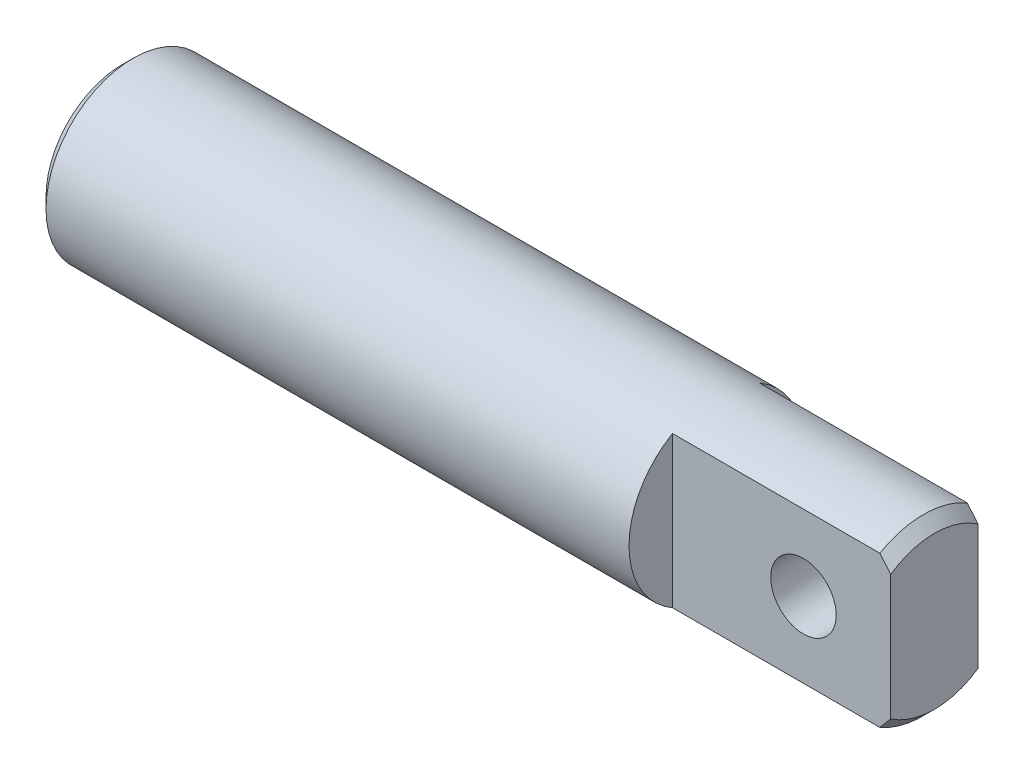
ISO-10303-21;
HEADER;
FILE_DESCRIPTION(('STEP AP214'),'2;1');
FILE_NAME('part.step','',(''),(''),'','','');
FILE_SCHEMA(('AUTOMOTIVE_DESIGN { 1 0 10303 214 1 1 1 1 }'));
ENDSEC;
DATA;
#1=APPLICATION_CONTEXT('core data for automotive mechanical design processes');
#2=APPLICATION_PROTOCOL_DEFINITION('international standard','automotive_design',2000,#1);
#3=PRODUCT_CONTEXT('',#1,'mechanical');
#4=PRODUCT('Part','Part','',(#3));
#5=PRODUCT_RELATED_PRODUCT_CATEGORY('part','',(#4));
#6=PRODUCT_DEFINITION_FORMATION('','',#4);
#7=PRODUCT_DEFINITION_CONTEXT('part definition',#1,'design');
#8=PRODUCT_DEFINITION('design','',#6,#7);
#9=PRODUCT_DEFINITION_SHAPE('','',#8);
#10=(LENGTH_UNIT() NAMED_UNIT(*) SI_UNIT(.MILLI.,.METRE.));
#11=(NAMED_UNIT(*) PLANE_ANGLE_UNIT() SI_UNIT($,.RADIAN.));
#12=(NAMED_UNIT(*) SI_UNIT($,.STERADIAN.) SOLID_ANGLE_UNIT());
#13=UNCERTAINTY_MEASURE_WITH_UNIT(LENGTH_MEASURE(1.E-05),#10,'distance_accuracy_value','');
#14=(GEOMETRIC_REPRESENTATION_CONTEXT(3) GLOBAL_UNCERTAINTY_ASSIGNED_CONTEXT((#13)) GLOBAL_UNIT_ASSIGNED_CONTEXT((#10,
#11,#12)) REPRESENTATION_CONTEXT('',''));
#15=CARTESIAN_POINT('',(0.,0.,0.));
#16=DIRECTION('',(0.,0.,1.));
#17=DIRECTION('',(1.,0.,0.));
#18=AXIS2_PLACEMENT_3D('',#15,#16,#17);
#19=CARTESIAN_POINT('',(-0.599999999999986,14.9999999999999,0.));
#20=DIRECTION('',(-1.,0.,0.));
#21=DIRECTION('',(0.,0.,1.));
#22=AXIS2_PLACEMENT_3D('',#19,#20,#21);
#23=CONICAL_SURFACE('',#22,2.1,1.02974425867665);
#24=CARTESIAN_POINT('',(0.661807299957892,14.9999999999999,0.));
#25=VERTEX_POINT('',#24);
#26=VERTEX_LOOP('',#25);
#27=FACE_BOUND('',#26,.T.);
#28=CARTESIAN_POINT('',(-0.599999999999986,14.9999999999999,0.));
#29=DIRECTION('',(-1.,0.,0.));
#30=DIRECTION('',(0.,0.,1.));
#31=AXIS2_PLACEMENT_3D('',#28,#29,#30);
#32=CIRCLE('',#31,2.1);
#33=CARTESIAN_POINT('',(-0.599999999999986,14.9999999999999,2.1));
#34=VERTEX_POINT('',#33);
#35=EDGE_CURVE('E77',#34,#34,#32,.T.);
#36=ORIENTED_EDGE('',*,*,#35,.T.);
#37=EDGE_LOOP('',(#36));
#38=FACE_BOUND('',#37,.T.);
#39=ADVANCED_FACE('F16',(#27,#38),#23,.F.);
#40=CARTESIAN_POINT('',(-21.78,14.9999999999999,0.));
#41=DIRECTION('',(-1.,0.,0.));
#42=DIRECTION('',(0.,0.,1.));
#43=AXIS2_PLACEMENT_3D('',#40,#41,#42);
#44=CYLINDRICAL_SURFACE('',#43,2.1);
#45=ORIENTED_EDGE('',*,*,#35,.F.);
#46=EDGE_LOOP('',(#45));
#47=FACE_BOUND('',#46,.T.);
#48=CARTESIAN_POINT('',(-2.99999999999999,14.9999999999999,0.));
#49=DIRECTION('',(-1.,0.,0.));
#50=DIRECTION('',(0.,0.,1.));
#51=AXIS2_PLACEMENT_3D('',#48,#49,#50);
#52=CIRCLE('',#51,2.1);
#53=CARTESIAN_POINT('',(-2.99999999999999,14.9999999999999,2.1));
#54=VERTEX_POINT('',#53);
#55=EDGE_CURVE('E79',#54,#54,#52,.T.);
#56=ORIENTED_EDGE('',*,*,#55,.T.);
#57=EDGE_LOOP('',(#56));
#58=FACE_BOUND('',#57,.T.);
#59=ADVANCED_FACE('F73',(#47,#58),#44,.F.);
#60=CARTESIAN_POINT('',(-2.99999999999999,17.0999999999999,0.));
#61=DIRECTION('',(1.,0.,0.));
#62=DIRECTION('',(0.,0.,-1.));
#63=AXIS2_PLACEMENT_3D('',#60,#61,#62);
#64=PLANE('',#63);
#65=ORIENTED_EDGE('',*,*,#55,.F.);
#66=EDGE_LOOP('',(#65));
#67=FACE_BOUND('',#66,.T.);
#68=CARTESIAN_POINT('',(-2.99999999999999,14.9999999999999,0.));
#69=DIRECTION('',(-1.,0.,0.));
#70=DIRECTION('',(0.,0.,1.));
#71=AXIS2_PLACEMENT_3D('',#68,#69,#70);
#72=CIRCLE('',#71,2.5);
#73=CARTESIAN_POINT('',(-2.99999999999999,14.9999999999999,2.5));
#74=VERTEX_POINT('',#73);
#75=EDGE_CURVE('E83',#74,#74,#72,.T.);
#76=ORIENTED_EDGE('',*,*,#75,.T.);
#77=EDGE_LOOP('',(#76));
#78=FACE_BOUND('',#77,.T.);
#79=ADVANCED_FACE('F198',(#67,#78),#64,.F.);
#80=CARTESIAN_POINT('',(-21.78,14.9999999999999,0.));
#81=DIRECTION('',(-1.,0.,0.));
#82=DIRECTION('',(0.,0.,1.));
#83=AXIS2_PLACEMENT_3D('',#80,#81,#82);
#84=CYLINDRICAL_SURFACE('',#83,2.5);
#85=ORIENTED_EDGE('',*,*,#75,.F.);
#86=EDGE_LOOP('',(#85));
#87=FACE_BOUND('',#86,.T.);
#88=CARTESIAN_POINT('',(-22.,14.9999999999999,0.));
#89=DIRECTION('',(-1.,0.,0.));
#90=DIRECTION('',(0.,0.,1.));
#91=AXIS2_PLACEMENT_3D('',#88,#89,#90);
#92=CIRCLE('',#91,2.5);
#93=CARTESIAN_POINT('',(-22.,14.9999999999999,2.5));
#94=VERTEX_POINT('',#93);
#95=EDGE_CURVE('E80',#94,#94,#92,.T.);
#96=ORIENTED_EDGE('',*,*,#95,.T.);
#97=EDGE_LOOP('',(#96));
#98=FACE_BOUND('',#97,.T.);
#99=ADVANCED_FACE('F164',(#87,#98),#84,.F.);
#100=CARTESIAN_POINT('',(15.22,14.9999999999999,0.));
#101=DIRECTION('',(-1.,0.,0.));
#102=DIRECTION('',(0.,0.,1.));
#103=AXIS2_PLACEMENT_3D('',#100,#101,#102);
#104=CONICAL_SURFACE('',#103,3.495,0.785398163397443);
#105=CARTESIAN_POINT('',(9.9164224383253,6.43174655435509,2.));
#106=CARTESIAN_POINT('',(10.1265610711491,6.64754817369593,2.));
#107=CARTESIAN_POINT('',(10.3365030502145,6.86354197413312,2.));
#108=CARTESIAN_POINT('',(10.7558601077184,7.29605469798561,2.));
#109=CARTESIAN_POINT('',(10.9652751678765,7.5125736391215,2.));
#110=CARTESIAN_POINT('',(11.3839178863779,7.94676825664768,2.));
#111=CARTESIAN_POINT('',(11.5931439692592,8.16444545301494,2.));
#112=CARTESIAN_POINT('',(12.0106964661649,8.60065038014004,2.));
#113=CARTESIAN_POINT('',(12.2190229045123,8.81917808759559,2.));
#114=CARTESIAN_POINT('',(12.6625473922232,9.2869923926392,2.));
#115=CARTESIAN_POINT('',(12.8975714726616,9.53644407382509,2.));
#116=CARTESIAN_POINT('',(13.365382542186,10.0374868658117,2.));
#117=CARTESIAN_POINT('',(13.5981693265889,10.2890781684647,2.));
#118=CARTESIAN_POINT('',(13.9444944603264,10.668676836453,2.));
#119=CARTESIAN_POINT('',(14.0593636160604,10.7954693125045,2.));
#120=CARTESIAN_POINT('',(14.2879575819006,11.0500807231577,2.));
#121=CARTESIAN_POINT('',(14.4016824058333,11.1778996453237,2.));
#122=CARTESIAN_POINT('',(14.6276208309937,11.4348338705895,2.));
#123=CARTESIAN_POINT('',(14.7398346591475,11.5639489738239,2.));
#124=CARTESIAN_POINT('',(14.9622539679496,11.8238944802724,2.));
#125=CARTESIAN_POINT('',(15.0724595441633,11.9547248013533,2.));
#126=CARTESIAN_POINT('',(15.2509674584486,12.1712548824459,2.));
#127=CARTESIAN_POINT('',(15.3200940076278,12.2562744592166,2.));
#128=CARTESIAN_POINT('',(15.4569007358004,12.4274788435985,2.));
#129=CARTESIAN_POINT('',(15.5245808509638,12.5136637023601,2.));
#130=CARTESIAN_POINT('',(15.6582798823296,12.6877168029346,2.));
#131=CARTESIAN_POINT('',(15.7242933858479,12.7755892167168,2.));
#132=CARTESIAN_POINT('',(15.8538736821759,12.9531172246593,2.));
#133=CARTESIAN_POINT('',(15.9174406919965,13.0427726595856,2.));
#134=CARTESIAN_POINT('',(16.0397325008814,13.2220116918911,2.));
#135=CARTESIAN_POINT('',(16.0985394083859,13.3115389167384,2.));
#136=CARTESIAN_POINT('',(16.2119750725487,13.4932878503426,2.));
#137=CARTESIAN_POINT('',(16.2666018895126,13.5855107828901,2.));
#138=CARTESIAN_POINT('',(16.3697861502893,13.7727633230229,2.));
#139=CARTESIAN_POINT('',(16.4183709121438,13.8677777028944,2.));
#140=CARTESIAN_POINT('',(16.5074204738147,14.0614989237175,2.));
#141=CARTESIAN_POINT('',(16.5478958460363,14.1602007553028,2.));
#142=CARTESIAN_POINT('',(16.6030220150854,14.3192323779838,2.));
#143=CARTESIAN_POINT('',(16.6213807318649,14.3782753482258,2.));
#144=CARTESIAN_POINT('',(16.6536619590802,14.4975937680992,2.));
#145=CARTESIAN_POINT('',(16.6675835516981,14.5578694699805,2.));
#146=CARTESIAN_POINT('',(16.6902938856327,14.6791218401361,2.));
#147=CARTESIAN_POINT('',(16.6991047061924,14.7400943150277,2.));
#148=CARTESIAN_POINT('',(16.7112104970251,14.862582307051,2.));
#149=CARTESIAN_POINT('',(16.714506488385,14.9240977215351,2.));
#150=CARTESIAN_POINT('',(16.7153920634469,15.047412776839,2.));
#151=CARTESIAN_POINT('',(16.7129591353816,15.1092125833611,2.));
#152=CARTESIAN_POINT('',(16.7024859271394,15.2323300147828,2.));
#153=CARTESIAN_POINT('',(16.6944453402081,15.2936476131187,2.));
#154=CARTESIAN_POINT('',(16.6731582781794,15.4156227530155,2.));
#155=CARTESIAN_POINT('',(16.6598902618416,15.4762764821604,2.));
#156=CARTESIAN_POINT('',(16.6287810282415,15.5963853864009,2.));
#157=CARTESIAN_POINT('',(16.6109393827061,15.6558404486911,2.));
#158=CARTESIAN_POINT('',(16.5489227599763,15.8401709094853,2.));
#159=CARTESIAN_POINT('',(16.497840214504,15.9627230464006,2.));
#160=CARTESIAN_POINT('',(16.3838644374412,16.2022228512532,2.));
#161=CARTESIAN_POINT('',(16.3209488779717,16.3191593906661,2.));
#162=CARTESIAN_POINT('',(16.1868797980904,16.5492496963114,2.));
#163=CARTESIAN_POINT('',(16.1156717742496,16.6623713117407,2.));
#164=CARTESIAN_POINT('',(16.004898834961,16.8293063300411,2.));
#165=CARTESIAN_POINT('',(15.9673306980646,16.8844712260242,2.));
#166=CARTESIAN_POINT('',(15.8910728320596,16.9940191019984,2.));
#167=CARTESIAN_POINT('',(15.8523831433383,17.0484021100402,2.));
#168=CARTESIAN_POINT('',(15.7277647668871,17.2204078132625,2.));
#169=CARTESIAN_POINT('',(15.6400819162954,17.3367585946478,2.));
#170=CARTESIAN_POINT('',(15.4616120642076,17.5670620663371,2.));
#171=CARTESIAN_POINT('',(15.3708245800271,17.6810143792559,2.));
#172=CARTESIAN_POINT('',(15.1869539430972,17.9071363012447,2.));
#173=CARTESIAN_POINT('',(15.0938697231723,18.0193050402017,2.));
#174=CARTESIAN_POINT('',(14.906009890199,18.2422194514275,2.));
#175=CARTESIAN_POINT('',(14.8112342151887,18.3529650713075,2.));
#176=CARTESIAN_POINT('',(14.5246660649253,18.6839099531016,2.));
#177=CARTESIAN_POINT('',(14.3309457821405,18.9024379286574,2.));
#178=CARTESIAN_POINT('',(13.9403909622291,19.336561567545,2.));
#179=CARTESIAN_POINT('',(13.7435573227561,19.5521580439207,2.));
#180=CARTESIAN_POINT('',(13.3482925056411,19.9808031463554,2.));
#181=CARTESIAN_POINT('',(13.1498670763614,20.19385707996,2.));
#182=CARTESIAN_POINT('',(12.7515192987213,20.6185863123391,2.));
#183=CARTESIAN_POINT('',(12.5515968463192,20.830261513345,2.));
#184=CARTESIAN_POINT('',(12.150833669179,21.252413066286,2.));
#185=CARTESIAN_POINT('',(11.9499938226034,21.4628902526065,2.));
#186=CARTESIAN_POINT('',(11.5475039831171,21.8830685886929,2.));
#187=CARTESIAN_POINT('',(11.3458539891456,22.0927697374421,2.));
#188=CARTESIAN_POINT('',(11.0418858761726,22.4079319483174,2.));
#189=CARTESIAN_POINT('',(10.9398003265283,22.5136174988749,2.));
#190=CARTESIAN_POINT('',(10.7354747698068,22.7248652599549,2.));
#191=CARTESIAN_POINT('',(10.6332347447099,22.83042745305,2.));
#192=CARTESIAN_POINT('',(10.4286237308527,23.041436236008,2.));
#193=CARTESIAN_POINT('',(10.3262527351095,23.1468828190984,2.));
#194=CARTESIAN_POINT('',(10.1214117871002,23.3576534749507,2.));
#195=CARTESIAN_POINT('',(10.018941849245,23.4629775617176,2.));
#196=CARTESIAN_POINT('',(9.9164224383253,23.5682534456448,2.));
#197=B_SPLINE_CURVE_WITH_KNOTS('',3,(#105,#106,#107,#108,#109,#110,#111,#112,#113,#114,#115,
#116,#117,#118,#119,#120,#121,#122,#123,#124,#125,#126,#127,#128,#129,#130,#131,#132,#133,#134,
#135,#136,#137,#138,#139,#140,#141,#142,#143,#144,#145,#146,#147,#148,#149,#150,#151,#152,#153,
#154,#155,#156,#157,#158,#159,#160,#161,#162,#163,#164,#165,#166,#167,#168,#169,#170,#171,#172,
#173,#174,#175,#176,#177,#178,#179,#180,#181,#182,#183,#184,#185,#186,#187,#188,#189,#190,#191,
#192,#193,#194,#195,#196),.UNSPECIFIED.,.F.,.F.,(4,2,2,2,2,2,2,2,2,2,2,2,2,2,2,2,2,2,2,2,2,2,2,
2,2,2,2,2,2,2,2,2,2,2,2,2,2,2,2,2,2,2,2,2,2,4),(0.,0.903636193784462,1.80730331677087,
2.71307747702475,3.61882699317427,4.64700319696608,5.67527258666949,6.18853289831541,
6.70178700105632,7.21496314207468,7.72811479878303,8.0568295854466,8.38555884823469,
8.71524558859147,9.04490301709644,9.36616107350936,9.68756731104285,10.0074630147977,
10.3269389094852,10.5122918000299,10.6976830059232,10.8822672136598,11.0668172413002,
11.2520936670242,11.4373802286797,11.6234384439018,11.809514087921,12.2067423548292,
12.6047278169828,13.0054948807139,13.2057131553988,13.4059242290945,13.8429116718964,
14.279967365821,14.7172301106781,15.1545089064926,16.0305420045028,16.9063269664553,
17.7797472787007,18.6532288669151,19.5260006907685,20.3987736577733,20.8395887748786,
21.280460047577,21.7213558968197,22.1621950741425),.UNSPECIFIED.);
#198=CARTESIAN_POINT('',(14.72,11.5416730923753,2.));
#199=VERTEX_POINT('',#198);
#200=CARTESIAN_POINT('',(15.22,12.1338135092077,2.));
#201=VERTEX_POINT('',#200);
#202=EDGE_CURVE('E173',#199,#201,#197,.T.);
#203=ORIENTED_EDGE('',*,*,#202,.F.);
#204=CARTESIAN_POINT('',(14.72,14.9999999999999,0.));
#205=DIRECTION('',(1.,0.,0.));
#206=DIRECTION('',(0.,0.,-1.));
#207=AXIS2_PLACEMENT_3D('',#204,#205,#206);
#208=CIRCLE('',#207,3.995);
#209=CARTESIAN_POINT('',(14.72,11.5416730923754,-2.));
#210=VERTEX_POINT('',#209);
#211=EDGE_CURVE('E118',#210,#199,#208,.F.);
#212=ORIENTED_EDGE('',*,*,#211,.F.);
#213=CARTESIAN_POINT('',(9.9164224383253,23.5682534456448,-2.));
#214=CARTESIAN_POINT('',(10.1265610711491,23.3524518263039,-2.));
#215=CARTESIAN_POINT('',(10.3365030502145,23.1364580258667,-2.));
#216=CARTESIAN_POINT('',(10.7558601077184,22.7039453020143,-2.));
#217=CARTESIAN_POINT('',(10.9652751678765,22.4874263608784,-2.));
#218=CARTESIAN_POINT('',(11.3839178863779,22.0532317433522,-2.));
#219=CARTESIAN_POINT('',(11.5931439692592,21.8355545469849,-2.));
#220=CARTESIAN_POINT('',(12.0106964661649,21.3993496198598,-2.));
#221=CARTESIAN_POINT('',(12.2190229045123,21.1808219124043,-2.));
#222=CARTESIAN_POINT('',(12.6625473922232,20.7130076073607,-2.));
#223=CARTESIAN_POINT('',(12.8975714726616,20.4635559261748,-2.));
#224=CARTESIAN_POINT('',(13.365382542186,19.9625131341881,-2.));
#225=CARTESIAN_POINT('',(13.5981693265889,19.7109218315351,-2.));
#226=CARTESIAN_POINT('',(13.9444944603264,19.3313231635469,-2.));
#227=CARTESIAN_POINT('',(14.0593636160603,19.2045306874954,-2.));
#228=CARTESIAN_POINT('',(14.2879575819006,18.9499192768422,-2.));
#229=CARTESIAN_POINT('',(14.4016824058333,18.8221003546762,-2.));
#230=CARTESIAN_POINT('',(14.6276208309937,18.5651661294104,-2.));
#231=CARTESIAN_POINT('',(14.7398346591475,18.4360510261759,-2.));
#232=CARTESIAN_POINT('',(14.9622539679496,18.1761055197275,-2.));
#233=CARTESIAN_POINT('',(15.0724595441633,18.0452751986466,-2.));
#234=CARTESIAN_POINT('',(15.2509674584485,17.828745117554,-2.));
#235=CARTESIAN_POINT('',(15.3200940076277,17.7437255407833,-2.));
#236=CARTESIAN_POINT('',(15.4569007358004,17.5725211564014,-2.));
#237=CARTESIAN_POINT('',(15.5245808509637,17.4863362976399,-2.));
#238=CARTESIAN_POINT('',(15.6582798823295,17.3122831970653,-2.));
#239=CARTESIAN_POINT('',(15.7242933858478,17.2244107832831,-2.));
#240=CARTESIAN_POINT('',(15.8538736821759,17.0468827753407,-2.));
#241=CARTESIAN_POINT('',(15.9174406919965,16.9572273404143,-2.));
#242=CARTESIAN_POINT('',(16.0397325008814,16.7779883081088,-2.));
#243=CARTESIAN_POINT('',(16.0985394083858,16.6884610832615,-2.));
#244=CARTESIAN_POINT('',(16.2119750725486,16.5067121496573,-2.));
#245=CARTESIAN_POINT('',(16.2666018895126,16.4144892171098,-2.));
#246=CARTESIAN_POINT('',(16.3697861502893,16.227236676977,-2.));
#247=CARTESIAN_POINT('',(16.4183709121437,16.1322222971055,-2.));
#248=CARTESIAN_POINT('',(16.5074204738147,15.9385010762824,-2.));
#249=CARTESIAN_POINT('',(16.5478958460363,15.8397992446972,-2.));
#250=CARTESIAN_POINT('',(16.6030220150854,15.6807676220161,-2.));
#251=CARTESIAN_POINT('',(16.6213807318649,15.6217246517741,-2.));
#252=CARTESIAN_POINT('',(16.6536619590802,15.5024062319007,-2.));
#253=CARTESIAN_POINT('',(16.6675835516981,15.4421305300195,-2.));
#254=CARTESIAN_POINT('',(16.6902938856327,15.3208781598638,-2.));
#255=CARTESIAN_POINT('',(16.6991047061924,15.2599056849722,-2.));
#256=CARTESIAN_POINT('',(16.7112104970251,15.1374176929489,-2.));
#257=CARTESIAN_POINT('',(16.714506488385,15.0759022784649,-2.));
#258=CARTESIAN_POINT('',(16.7153920634469,14.9525872231609,-2.));
#259=CARTESIAN_POINT('',(16.7129591353816,14.8907874166388,-2.));
#260=CARTESIAN_POINT('',(16.7024859271394,14.7676699852171,-2.));
#261=CARTESIAN_POINT('',(16.6944453402081,14.7063523868813,-2.));
#262=CARTESIAN_POINT('',(16.6731582781794,14.5843772469844,-2.));
#263=CARTESIAN_POINT('',(16.6598902618416,14.5237235178396,-2.));
#264=CARTESIAN_POINT('',(16.6287810282415,14.403614613599,-2.));
#265=CARTESIAN_POINT('',(16.6109393827061,14.3441595513088,-2.));
#266=CARTESIAN_POINT('',(16.5489227599764,14.1598290905146,-2.));
#267=CARTESIAN_POINT('',(16.4978402145041,14.0372769535993,-2.));
#268=CARTESIAN_POINT('',(16.3838644374413,13.7977771487467,-2.));
#269=CARTESIAN_POINT('',(16.3209488779717,13.6808406093338,-2.));
#270=CARTESIAN_POINT('',(16.1868797980904,13.4507503036885,-2.));
#271=CARTESIAN_POINT('',(16.1156717742497,13.3376286882592,-2.));
#272=CARTESIAN_POINT('',(16.0048988349611,13.1706936699589,-2.));
#273=CARTESIAN_POINT('',(15.9673306980647,13.1155287739757,-2.));
#274=CARTESIAN_POINT('',(15.8910728320596,13.0059808980016,-2.));
#275=CARTESIAN_POINT('',(15.8523831433384,12.9515978899598,-2.));
#276=CARTESIAN_POINT('',(15.7277647668872,12.7795921867375,-2.));
#277=CARTESIAN_POINT('',(15.6400819162955,12.6632414053522,-2.));
#278=CARTESIAN_POINT('',(15.4616120642078,12.4329379336629,-2.));
#279=CARTESIAN_POINT('',(15.3708245800273,12.3189856207442,-2.));
#280=CARTESIAN_POINT('',(15.1869539430974,12.0928636987554,-2.));
#281=CARTESIAN_POINT('',(15.0938697231725,11.9806949597984,-2.));
#282=CARTESIAN_POINT('',(14.9060098901992,11.7577805485726,-2.));
#283=CARTESIAN_POINT('',(14.8112342151889,11.6470349286926,-2.));
#284=CARTESIAN_POINT('',(14.5246660649255,11.3160900468985,-2.));
#285=CARTESIAN_POINT('',(14.3309457821407,11.0975620713427,-2.));
#286=CARTESIAN_POINT('',(13.9403909622293,10.6634384324552,-2.));
#287=CARTESIAN_POINT('',(13.7435573227564,10.4478419560795,-2.));
#288=CARTESIAN_POINT('',(13.3482925056414,10.0191968536448,-2.));
#289=CARTESIAN_POINT('',(13.1498670763617,9.80614292004025,-2.));
#290=CARTESIAN_POINT('',(12.7515192987217,9.3814136876612,-2.));
#291=CARTESIAN_POINT('',(12.5515968463196,9.16973848665527,-2.));
#292=CARTESIAN_POINT('',(12.1508336691794,8.74758693371432,-2.));
#293=CARTESIAN_POINT('',(11.9499938226039,8.53710974739384,-2.));
#294=CARTESIAN_POINT('',(11.5475039831176,8.11693141130742,-2.));
#295=CARTESIAN_POINT('',(11.3458539891461,7.9072302625583,-2.));
#296=CARTESIAN_POINT('',(11.0418858761731,7.59206805168298,-2.));
#297=CARTESIAN_POINT('',(10.9398003265288,7.48638250112545,-2.));
#298=CARTESIAN_POINT('',(10.7354747698072,7.27513474004532,-2.));
#299=CARTESIAN_POINT('',(10.6332347447102,7.16957254695015,-2.));
#300=CARTESIAN_POINT('',(10.4286237308529,6.9585637639921,-2.));
#301=CARTESIAN_POINT('',(10.3262527351097,6.8531171809016,-2.));
#302=CARTESIAN_POINT('',(10.1214117871002,6.64234652504926,-2.));
#303=CARTESIAN_POINT('',(10.018941849245,6.53702243828234,-2.));
#304=CARTESIAN_POINT('',(9.9164224383253,6.43174655435509,-2.));
#305=B_SPLINE_CURVE_WITH_KNOTS('',3,(#213,#214,#215,#216,#217,#218,#219,#220,#221,#222,#223,
#224,#225,#226,#227,#228,#229,#230,#231,#232,#233,#234,#235,#236,#237,#238,#239,#240,#241,#242,
#243,#244,#245,#246,#247,#248,#249,#250,#251,#252,#253,#254,#255,#256,#257,#258,#259,#260,#261,
#262,#263,#264,#265,#266,#267,#268,#269,#270,#271,#272,#273,#274,#275,#276,#277,#278,#279,#280,
#281,#282,#283,#284,#285,#286,#287,#288,#289,#290,#291,#292,#293,#294,#295,#296,#297,#298,#299,
#300,#301,#302,#303,#304),.UNSPECIFIED.,.F.,.F.,(4,2,2,2,2,2,2,2,2,2,2,2,2,2,2,2,2,2,2,2,2,2,2,
2,2,2,2,2,2,2,2,2,2,2,2,2,2,2,2,2,2,2,2,2,2,4),(0.,0.90363619378446,1.80730331677087,
2.71307747702475,3.61882699317427,4.64700319696606,5.67527258666946,6.18853289831537,
6.70178700105628,7.21496314207464,7.72811479878297,8.05682958544655,8.38555884823463,
8.7152455885914,9.04490301709637,9.36616107350929,9.68756731104277,10.0074630147976,
10.3269389094852,10.5122918000299,10.6976830059232,10.8822672136597,11.0668172413001,
11.2520936670241,11.4373802286797,11.6234384439017,11.8095140879209,12.2067423548291,
12.6047278169827,13.0054948807138,13.2057131553986,13.4059242290944,13.8429116718962,
14.2799673658208,14.7172301106778,15.1545089064923,16.0305420045024,16.9063269664548,
17.7797472787002,18.6532288669145,19.5260006907679,20.3987736577725,20.839588774878,
21.2804600475766,21.7213558968195,22.1621950741425),.UNSPECIFIED.);
#306=CARTESIAN_POINT('',(15.22,12.1338135092077,-2.));
#307=VERTEX_POINT('',#306);
#308=EDGE_CURVE('E124',#307,#210,#305,.T.);
#309=ORIENTED_EDGE('',*,*,#308,.F.);
#310=CARTESIAN_POINT('',(15.22,14.9999999999999,0.));
#311=DIRECTION('',(1.,0.,0.));
#312=DIRECTION('',(0.,0.,-1.));
#313=AXIS2_PLACEMENT_3D('',#310,#311,#312);
#314=CIRCLE('',#313,3.495);
#315=EDGE_CURVE('E38',#201,#307,#314,.T.);
#316=ORIENTED_EDGE('',*,*,#315,.F.);
#317=EDGE_LOOP('',(#203,#212,#309,#316));
#318=FACE_BOUND('',#317,.T.);
#319=ADVANCED_FACE('F158',(#318),#104,.T.);
#320=CARTESIAN_POINT('',(15.22,14.9999999999999,0.));
#321=DIRECTION('',(-1.,0.,0.));
#322=DIRECTION('',(0.,0.,1.));
#323=AXIS2_PLACEMENT_3D('',#320,#321,#322);
#324=CYLINDRICAL_SURFACE('',#323,3.995);
#325=CARTESIAN_POINT('',(-21.5,14.9999999999999,0.));
#326=DIRECTION('',(-1.,0.,0.));
#327=DIRECTION('',(0.,0.,1.));
#328=AXIS2_PLACEMENT_3D('',#325,#326,#327);
#329=CIRCLE('',#328,3.995);
#330=CARTESIAN_POINT('',(-21.5,14.9999999999999,3.995));
#331=VERTEX_POINT('',#330);
#332=EDGE_CURVE('E11',#331,#331,#329,.F.);
#333=ORIENTED_EDGE('',*,*,#332,.T.);
#334=EDGE_LOOP('',(#333));
#335=FACE_BOUND('',#334,.T.);
#336=ORIENTED_EDGE('',*,*,#211,.T.);
#337=DIRECTION('',(-1.,0.,0.));
#338=VECTOR('',#337,1.);
#339=CARTESIAN_POINT('',(15.22,11.5416730923754,2.));
#340=LINE('',#339,#338);
#341=CARTESIAN_POINT('',(5.22000000000001,11.5416730923754,2.));
#342=VERTEX_POINT('',#341);
#343=EDGE_CURVE('E97',#199,#342,#340,.T.);
#344=ORIENTED_EDGE('',*,*,#343,.T.);
#345=CARTESIAN_POINT('',(5.22000000000001,14.9999999999999,0.));
#346=DIRECTION('',(-1.,0.,0.));
#347=DIRECTION('',(0.,0.,1.));
#348=AXIS2_PLACEMENT_3D('',#345,#346,#347);
#349=CIRCLE('',#348,3.995);
#350=CARTESIAN_POINT('',(5.22000000000001,18.4583269076245,2.));
#351=VERTEX_POINT('',#350);
#352=EDGE_CURVE('E174',#342,#351,#349,.T.);
#353=ORIENTED_EDGE('',*,*,#352,.T.);
#354=DIRECTION('',(-1.,0.,0.));
#355=VECTOR('',#354,1.);
#356=CARTESIAN_POINT('',(15.22,18.4583269076245,2.));
#357=LINE('',#356,#355);
#358=CARTESIAN_POINT('',(14.72,18.4583269076245,2.));
#359=VERTEX_POINT('',#358);
#360=EDGE_CURVE('E94',#351,#359,#357,.F.);
#361=ORIENTED_EDGE('',*,*,#360,.T.);
#362=CARTESIAN_POINT('',(14.72,18.4583269076246,-2.));
#363=VERTEX_POINT('',#362);
#364=EDGE_CURVE('E117',#359,#363,#208,.F.);
#365=ORIENTED_EDGE('',*,*,#364,.T.);
#366=DIRECTION('',(-1.,0.,0.));
#367=VECTOR('',#366,1.);
#368=CARTESIAN_POINT('',(15.22,18.4583269076245,-2.));
#369=LINE('',#368,#367);
#370=CARTESIAN_POINT('',(5.22000000000001,18.4583269076245,-2.));
#371=VERTEX_POINT('',#370);
#372=EDGE_CURVE('E111',#363,#371,#369,.T.);
#373=ORIENTED_EDGE('',*,*,#372,.T.);
#374=CARTESIAN_POINT('',(5.22000000000001,14.9999999999999,0.));
#375=DIRECTION('',(-1.,0.,0.));
#376=DIRECTION('',(0.,0.,1.));
#377=AXIS2_PLACEMENT_3D('',#374,#375,#376);
#378=CIRCLE('',#377,3.995);
#379=CARTESIAN_POINT('',(5.22000000000001,11.5416730923754,-2.));
#380=VERTEX_POINT('',#379);
#381=EDGE_CURVE('E131',#371,#380,#378,.T.);
#382=ORIENTED_EDGE('',*,*,#381,.T.);
#383=DIRECTION('',(-1.,0.,0.));
#384=VECTOR('',#383,1.);
#385=CARTESIAN_POINT('',(15.22,11.5416730923754,-2.));
#386=LINE('',#385,#384);
#387=EDGE_CURVE('E108',#380,#210,#386,.F.);
#388=ORIENTED_EDGE('',*,*,#387,.T.);
#389=EDGE_LOOP('',(#336,#344,#353,#361,#365,#373,#382,#388));
#390=FACE_BOUND('',#389,.T.);
#391=ADVANCED_FACE('F156',(#335,#390),#324,.T.);
#392=CARTESIAN_POINT('',(15.22,14.9999999999999,0.));
#393=DIRECTION('',(1.,0.,0.));
#394=DIRECTION('',(0.,0.,-1.));
#395=AXIS2_PLACEMENT_3D('',#392,#393,#394);
#396=PLANE('',#395);
#397=DIRECTION('',(0.,1.,0.));
#398=VECTOR('',#397,1.);
#399=CARTESIAN_POINT('',(15.22,14.9999999999999,2.));
#400=LINE('',#399,#398);
#401=CARTESIAN_POINT('',(15.22,17.8661864907922,2.));
#402=VERTEX_POINT('',#401);
#403=EDGE_CURVE('E31',#201,#402,#400,.T.);
#404=ORIENTED_EDGE('',*,*,#403,.F.);
#405=ORIENTED_EDGE('',*,*,#315,.T.);
#406=DIRECTION('',(0.,-1.,0.));
#407=VECTOR('',#406,1.);
#408=CARTESIAN_POINT('',(15.22,14.9999999999999,-2.));
#409=LINE('',#408,#407);
#410=CARTESIAN_POINT('',(15.22,17.8661864907922,-2.));
#411=VERTEX_POINT('',#410);
#412=EDGE_CURVE('E106',#411,#307,#409,.T.);
#413=ORIENTED_EDGE('',*,*,#412,.F.);
#414=EDGE_CURVE('E121',#411,#402,#314,.T.);
#415=ORIENTED_EDGE('',*,*,#414,.T.);
#416=EDGE_LOOP('',(#404,#405,#413,#415));
#417=FACE_BOUND('',#416,.T.);
#418=ADVANCED_FACE('F153',(#417),#396,.T.);
#419=CARTESIAN_POINT('',(11.22,14.9999999999999,-18.5));
#420=DIRECTION('',(0.,0.,1.));
#421=DIRECTION('',(1.,0.,0.));
#422=AXIS2_PLACEMENT_3D('',#419,#420,#421);
#423=CYLINDRICAL_SURFACE('',#422,1.5);
#424=CARTESIAN_POINT('',(11.22,14.9999999999999,2.));
#425=DIRECTION('',(0.,0.,-1.));
#426=DIRECTION('',(-1.,0.,0.));
#427=AXIS2_PLACEMENT_3D('',#424,#425,#426);
#428=CIRCLE('',#427,1.5);
#429=CARTESIAN_POINT('',(9.72000000000001,14.9999999999999,2.));
#430=VERTEX_POINT('',#429);
#431=EDGE_CURVE('E100',#430,#430,#428,.F.);
#432=ORIENTED_EDGE('',*,*,#431,.T.);
#433=EDGE_LOOP('',(#432));
#434=FACE_BOUND('',#433,.T.);
#435=CARTESIAN_POINT('',(11.22,14.9999999999999,-2.));
#436=DIRECTION('',(0.,0.,1.));
#437=DIRECTION('',(1.,0.,0.));
#438=AXIS2_PLACEMENT_3D('',#435,#436,#437);
#439=CIRCLE('',#438,1.5);
#440=CARTESIAN_POINT('',(12.72,14.9999999999999,-2.));
#441=VERTEX_POINT('',#440);
#442=EDGE_CURVE('E114',#441,#441,#439,.F.);
#443=ORIENTED_EDGE('',*,*,#442,.T.);
#444=EDGE_LOOP('',(#443));
#445=FACE_BOUND('',#444,.T.);
#446=ADVANCED_FACE('F150',(#434,#445),#423,.F.);
#447=EDGE_CURVE('E175',#402,#359,#197,.T.);
#448=ORIENTED_EDGE('',*,*,#447,.F.);
#449=ORIENTED_EDGE('',*,*,#414,.F.);
#450=EDGE_CURVE('E130',#363,#411,#305,.T.);
#451=ORIENTED_EDGE('',*,*,#450,.F.);
#452=ORIENTED_EDGE('',*,*,#364,.F.);
#453=EDGE_LOOP('',(#448,#449,#451,#452));
#454=FACE_BOUND('',#453,.T.);
#455=ADVANCED_FACE('F133',(#454),#104,.T.);
#456=CARTESIAN_POINT('',(5.22000000000001,-3.50000000000007,-6.93119305856833));
#457=DIRECTION('',(-1.,0.,0.));
#458=DIRECTION('',(0.,0.,1.));
#459=AXIS2_PLACEMENT_3D('',#456,#457,#458);
#460=PLANE('',#459);
#461=DIRECTION('',(0.,1.,0.));
#462=VECTOR('',#461,1.);
#463=CARTESIAN_POINT('',(5.22000000000001,-3.50000000000007,-2.));
#464=LINE('',#463,#462);
#465=EDGE_CURVE('E103',#380,#371,#464,.T.);
#466=ORIENTED_EDGE('',*,*,#465,.F.);
#467=ORIENTED_EDGE('',*,*,#381,.F.);
#468=EDGE_LOOP('',(#466,#467));
#469=FACE_BOUND('',#468,.T.);
#470=ADVANCED_FACE('F142',(#469),#460,.F.);
#471=CARTESIAN_POINT('',(5.22000000000001,-3.50000000000007,-2.));
#472=DIRECTION('',(0.,0.,1.));
#473=DIRECTION('',(1.,0.,0.));
#474=AXIS2_PLACEMENT_3D('',#471,#472,#473);
#475=PLANE('',#474);
#476=ORIENTED_EDGE('',*,*,#450,.T.);
#477=ORIENTED_EDGE('',*,*,#412,.T.);
#478=ORIENTED_EDGE('',*,*,#308,.T.);
#479=ORIENTED_EDGE('',*,*,#387,.F.);
#480=ORIENTED_EDGE('',*,*,#465,.T.);
#481=ORIENTED_EDGE('',*,*,#372,.F.);
#482=EDGE_LOOP('',(#476,#477,#478,#479,#480,#481));
#483=FACE_BOUND('',#482,.T.);
#484=ORIENTED_EDGE('',*,*,#442,.F.);
#485=EDGE_LOOP('',(#484));
#486=FACE_BOUND('',#485,.T.);
#487=ADVANCED_FACE('F136',(#483,#486),#475,.F.);
#488=CARTESIAN_POINT('',(5.22000000000001,-3.50000000000007,2.));
#489=DIRECTION('',(-1.,0.,0.));
#490=DIRECTION('',(0.,0.,1.));
#491=AXIS2_PLACEMENT_3D('',#488,#489,#490);
#492=PLANE('',#491);
#493=DIRECTION('',(0.,1.,0.));
#494=VECTOR('',#493,1.);
#495=CARTESIAN_POINT('',(5.22000000000001,-3.50000000000007,2.));
#496=LINE('',#495,#494);
#497=EDGE_CURVE('E90',#342,#351,#496,.T.);
#498=ORIENTED_EDGE('',*,*,#497,.T.);
#499=ORIENTED_EDGE('',*,*,#352,.F.);
#500=EDGE_LOOP('',(#498,#499));
#501=FACE_BOUND('',#500,.T.);
#502=ADVANCED_FACE('F141',(#501),#492,.F.);
#503=CARTESIAN_POINT('',(18.7807809110629,-3.50000000000007,2.));
#504=DIRECTION('',(0.,0.,-1.));
#505=DIRECTION('',(-1.,0.,0.));
#506=AXIS2_PLACEMENT_3D('',#503,#504,#505);
#507=PLANE('',#506);
#508=ORIENTED_EDGE('',*,*,#202,.T.);
#509=ORIENTED_EDGE('',*,*,#403,.T.);
#510=ORIENTED_EDGE('',*,*,#447,.T.);
#511=ORIENTED_EDGE('',*,*,#360,.F.);
#512=ORIENTED_EDGE('',*,*,#497,.F.);
#513=ORIENTED_EDGE('',*,*,#343,.F.);
#514=EDGE_LOOP('',(#508,#509,#510,#511,#512,#513));
#515=FACE_BOUND('',#514,.T.);
#516=ORIENTED_EDGE('',*,*,#431,.F.);
#517=EDGE_LOOP('',(#516));
#518=FACE_BOUND('',#517,.T.);
#519=ADVANCED_FACE('F144',(#515,#518),#507,.F.);
#520=CARTESIAN_POINT('',(-22.,14.9999999999999,0.));
#521=DIRECTION('',(-1.,0.,0.));
#522=DIRECTION('',(0.,0.,1.));
#523=AXIS2_PLACEMENT_3D('',#520,#521,#522);
#524=PLANE('',#523);
#525=CARTESIAN_POINT('',(-22.,14.9999999999999,0.));
#526=DIRECTION('',(-1.,0.,0.));
#527=DIRECTION('',(0.,0.,1.));
#528=AXIS2_PLACEMENT_3D('',#525,#526,#527);
#529=CIRCLE('',#528,3.49499999999999);
#530=CARTESIAN_POINT('',(-22.,14.9999999999999,3.49499999999999));
#531=VERTEX_POINT('',#530);
#532=EDGE_CURVE('E24',#531,#531,#529,.T.);
#533=ORIENTED_EDGE('',*,*,#532,.T.);
#534=EDGE_LOOP('',(#533));
#535=FACE_BOUND('',#534,.T.);
#536=ORIENTED_EDGE('',*,*,#95,.F.);
#537=EDGE_LOOP('',(#536));
#538=FACE_BOUND('',#537,.T.);
#539=ADVANCED_FACE('F183',(#535,#538),#524,.T.);
#540=CARTESIAN_POINT('',(-22.,14.9999999999999,0.));
#541=DIRECTION('',(1.,0.,0.));
#542=DIRECTION('',(0.,0.,-1.));
#543=AXIS2_PLACEMENT_3D('',#540,#541,#542);
#544=CONICAL_SURFACE('',#543,3.49499999999999,0.785398163397447);
#545=ORIENTED_EDGE('',*,*,#332,.F.);
#546=EDGE_LOOP('',(#545));
#547=FACE_BOUND('',#546,.T.);
#548=ORIENTED_EDGE('',*,*,#532,.F.);
#549=EDGE_LOOP('',(#548));
#550=FACE_BOUND('',#549,.T.);
#551=ADVANCED_FACE('F18',(#547,#550),#544,.T.);
#552=CLOSED_SHELL('',(#39,#59,#79,#99,#319,#391,#418,#446,#455,#470,#487,#502,#519,#539,#551));
#553=MANIFOLD_SOLID_BREP('B1',#552);
#554=ADVANCED_BREP_SHAPE_REPRESENTATION('',(#18,#553),#14);
#555=SHAPE_DEFINITION_REPRESENTATION(#9,#554);
ENDSEC;
END-ISO-10303-21;
